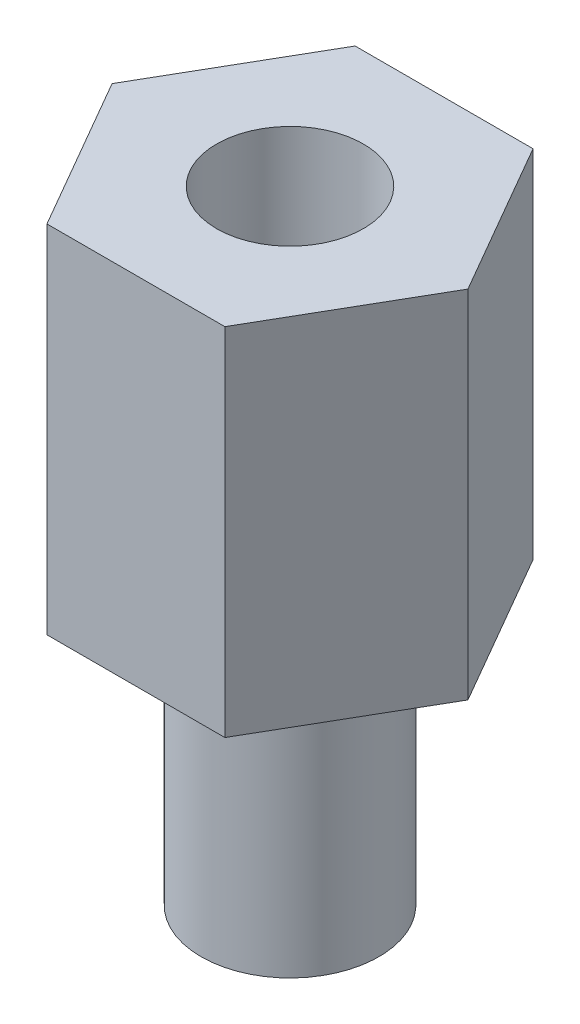
ISO-10303-21;
HEADER;
FILE_DESCRIPTION(('STEP AP214'),'2;1');
FILE_NAME('part.step','',(''),(''),'','','');
FILE_SCHEMA(('AUTOMOTIVE_DESIGN { 1 0 10303 214 1 1 1 1 }'));
ENDSEC;
DATA;
#1=APPLICATION_CONTEXT('core data for automotive mechanical design processes');
#2=APPLICATION_PROTOCOL_DEFINITION('international standard','automotive_design',2000,#1);
#3=PRODUCT_CONTEXT('',#1,'mechanical');
#4=PRODUCT('Part','Part','',(#3));
#5=PRODUCT_RELATED_PRODUCT_CATEGORY('part','',(#4));
#6=PRODUCT_DEFINITION_FORMATION('','',#4);
#7=PRODUCT_DEFINITION_CONTEXT('part definition',#1,'design');
#8=PRODUCT_DEFINITION('design','',#6,#7);
#9=PRODUCT_DEFINITION_SHAPE('','',#8);
#10=(LENGTH_UNIT() NAMED_UNIT(*) SI_UNIT(.MILLI.,.METRE.));
#11=(NAMED_UNIT(*) PLANE_ANGLE_UNIT() SI_UNIT($,.RADIAN.));
#12=(NAMED_UNIT(*) SI_UNIT($,.STERADIAN.) SOLID_ANGLE_UNIT());
#13=UNCERTAINTY_MEASURE_WITH_UNIT(LENGTH_MEASURE(1.E-05),#10,'distance_accuracy_value','');
#14=(GEOMETRIC_REPRESENTATION_CONTEXT(3) GLOBAL_UNCERTAINTY_ASSIGNED_CONTEXT((#13)) GLOBAL_UNIT_ASSIGNED_CONTEXT((#10,
#11,#12)) REPRESENTATION_CONTEXT('',''));
#15=CARTESIAN_POINT('',(0.,0.,0.));
#16=DIRECTION('',(0.,0.,1.));
#17=DIRECTION('',(1.,0.,0.));
#18=AXIS2_PLACEMENT_3D('',#15,#16,#17);
#19=CARTESIAN_POINT('',(0.,-6.,0.));
#20=DIRECTION('',(0.,1.,0.));
#21=DIRECTION('',(0.,0.,1.));
#22=AXIS2_PLACEMENT_3D('',#19,#20,#21);
#23=CYLINDRICAL_SURFACE('',#22,2.);
#24=CARTESIAN_POINT('',(0.,-6.,0.));
#25=DIRECTION('',(0.,1.,0.));
#26=DIRECTION('',(0.,0.,1.));
#27=AXIS2_PLACEMENT_3D('',#24,#25,#26);
#28=CIRCLE('',#27,2.);
#29=CARTESIAN_POINT('',(0.,-6.,2.));
#30=VERTEX_POINT('',#29);
#31=EDGE_CURVE('E11',#30,#30,#28,.T.);
#32=ORIENTED_EDGE('',*,*,#31,.T.);
#33=EDGE_LOOP('',(#32));
#34=FACE_BOUND('',#33,.T.);
#35=CARTESIAN_POINT('',(0.,0.,0.));
#36=DIRECTION('',(0.,1.,0.));
#37=DIRECTION('',(0.,0.,1.));
#38=AXIS2_PLACEMENT_3D('',#35,#36,#37);
#39=CIRCLE('',#38,2.);
#40=CARTESIAN_POINT('',(0.,0.,2.));
#41=VERTEX_POINT('',#40);
#42=EDGE_CURVE('E35',#41,#41,#39,.T.);
#43=ORIENTED_EDGE('',*,*,#42,.F.);
#44=EDGE_LOOP('',(#43));
#45=FACE_BOUND('',#44,.T.);
#46=ADVANCED_FACE('F32',(#34,#45),#23,.T.);
#47=CARTESIAN_POINT('',(0.,-6.,0.));
#48=DIRECTION('',(0.,1.,0.));
#49=DIRECTION('',(0.,0.,1.));
#50=AXIS2_PLACEMENT_3D('',#47,#48,#49);
#51=PLANE('',#50);
#52=ORIENTED_EDGE('',*,*,#31,.F.);
#53=EDGE_LOOP('',(#52));
#54=FACE_BOUND('',#53,.T.);
#55=ADVANCED_FACE('F146',(#54),#51,.F.);
#56=CARTESIAN_POINT('',(2.,8.,3.46410161513775));
#57=DIRECTION('',(-0.866025403784439,0.,-0.5));
#58=DIRECTION('',(-0.5,0.,0.866025403784439));
#59=AXIS2_PLACEMENT_3D('',#56,#57,#58);
#60=PLANE('',#59);
#61=DIRECTION('',(0.5,0.,-0.866025403784439));
#62=VECTOR('',#61,1.);
#63=CARTESIAN_POINT('',(2.,0.,3.46410161513775));
#64=LINE('',#63,#62);
#65=CARTESIAN_POINT('',(2.,0.,3.46410161513775));
#66=VERTEX_POINT('',#65);
#67=CARTESIAN_POINT('',(4.,0.,0.));
#68=VERTEX_POINT('',#67);
#69=EDGE_CURVE('E119',#66,#68,#64,.T.);
#70=ORIENTED_EDGE('',*,*,#69,.T.);
#71=DIRECTION('',(0.,-1.,0.));
#72=VECTOR('',#71,1.);
#73=CARTESIAN_POINT('',(4.,8.,0.));
#74=LINE('',#73,#72);
#75=CARTESIAN_POINT('',(4.,8.,0.));
#76=VERTEX_POINT('',#75);
#77=EDGE_CURVE('E137',#76,#68,#74,.T.);
#78=ORIENTED_EDGE('',*,*,#77,.F.);
#79=DIRECTION('',(0.5,0.,-0.866025403784439));
#80=VECTOR('',#79,1.);
#81=CARTESIAN_POINT('',(2.,8.,3.46410161513775));
#82=LINE('',#81,#80);
#83=CARTESIAN_POINT('',(2.,8.,3.46410161513775));
#84=VERTEX_POINT('',#83);
#85=EDGE_CURVE('E130',#84,#76,#82,.T.);
#86=ORIENTED_EDGE('',*,*,#85,.F.);
#87=DIRECTION('',(0.,-1.,0.));
#88=VECTOR('',#87,1.);
#89=CARTESIAN_POINT('',(2.,8.,3.46410161513775));
#90=LINE('',#89,#88);
#91=EDGE_CURVE('E115',#84,#66,#90,.T.);
#92=ORIENTED_EDGE('',*,*,#91,.T.);
#93=EDGE_LOOP('',(#70,#78,#86,#92));
#94=FACE_BOUND('',#93,.T.);
#95=ADVANCED_FACE('F151',(#94),#60,.F.);
#96=CARTESIAN_POINT('',(4.,8.,0.));
#97=DIRECTION('',(-0.866025403784439,0.,0.5));
#98=DIRECTION('',(0.5,0.,0.866025403784438));
#99=AXIS2_PLACEMENT_3D('',#96,#97,#98);
#100=PLANE('',#99);
#101=DIRECTION('',(-0.5,0.,-0.866025403784438));
#102=VECTOR('',#101,1.);
#103=CARTESIAN_POINT('',(4.,0.,0.));
#104=LINE('',#103,#102);
#105=CARTESIAN_POINT('',(2.,0.,-3.46410161513776));
#106=VERTEX_POINT('',#105);
#107=EDGE_CURVE('E122',#68,#106,#104,.T.);
#108=ORIENTED_EDGE('',*,*,#107,.T.);
#109=DIRECTION('',(0.,-1.,0.));
#110=VECTOR('',#109,1.);
#111=CARTESIAN_POINT('',(2.,8.,-3.46410161513776));
#112=LINE('',#111,#110);
#113=CARTESIAN_POINT('',(2.,8.,-3.46410161513776));
#114=VERTEX_POINT('',#113);
#115=EDGE_CURVE('E134',#114,#106,#112,.T.);
#116=ORIENTED_EDGE('',*,*,#115,.F.);
#117=DIRECTION('',(-0.5,0.,-0.866025403784438));
#118=VECTOR('',#117,1.);
#119=CARTESIAN_POINT('',(4.,8.,0.));
#120=LINE('',#119,#118);
#121=EDGE_CURVE('E87',#76,#114,#120,.T.);
#122=ORIENTED_EDGE('',*,*,#121,.F.);
#123=ORIENTED_EDGE('',*,*,#77,.T.);
#124=EDGE_LOOP('',(#108,#116,#122,#123));
#125=FACE_BOUND('',#124,.T.);
#126=ADVANCED_FACE('F157',(#125),#100,.F.);
#127=CARTESIAN_POINT('',(2.,8.,-3.46410161513776));
#128=DIRECTION('',(0.,0.,1.));
#129=DIRECTION('',(1.,0.,0.));
#130=AXIS2_PLACEMENT_3D('',#127,#128,#129);
#131=PLANE('',#130);
#132=DIRECTION('',(-1.,0.,0.));
#133=VECTOR('',#132,1.);
#134=CARTESIAN_POINT('',(2.,0.,-3.46410161513776));
#135=LINE('',#134,#133);
#136=CARTESIAN_POINT('',(-2.,0.,-3.46410161513775));
#137=VERTEX_POINT('',#136);
#138=EDGE_CURVE('E125',#106,#137,#135,.T.);
#139=ORIENTED_EDGE('',*,*,#138,.T.);
#140=DIRECTION('',(0.,-1.,0.));
#141=VECTOR('',#140,1.);
#142=CARTESIAN_POINT('',(-2.,8.,-3.46410161513775));
#143=LINE('',#142,#141);
#144=CARTESIAN_POINT('',(-2.,8.,-3.46410161513775));
#145=VERTEX_POINT('',#144);
#146=EDGE_CURVE('E110',#145,#137,#143,.T.);
#147=ORIENTED_EDGE('',*,*,#146,.F.);
#148=DIRECTION('',(-1.,0.,0.));
#149=VECTOR('',#148,1.);
#150=CARTESIAN_POINT('',(2.,8.,-3.46410161513776));
#151=LINE('',#150,#149);
#152=EDGE_CURVE('E101',#114,#145,#151,.T.);
#153=ORIENTED_EDGE('',*,*,#152,.F.);
#154=ORIENTED_EDGE('',*,*,#115,.T.);
#155=EDGE_LOOP('',(#139,#147,#153,#154));
#156=FACE_BOUND('',#155,.T.);
#157=ADVANCED_FACE('F163',(#156),#131,.F.);
#158=CARTESIAN_POINT('',(-2.,8.,-3.46410161513775));
#159=DIRECTION('',(0.866025403784439,0.,0.5));
#160=DIRECTION('',(0.5,0.,-0.866025403784439));
#161=AXIS2_PLACEMENT_3D('',#158,#159,#160);
#162=PLANE('',#161);
#163=DIRECTION('',(-0.5,0.,0.866025403784439));
#164=VECTOR('',#163,1.);
#165=CARTESIAN_POINT('',(-2.,0.,-3.46410161513775));
#166=LINE('',#165,#164);
#167=CARTESIAN_POINT('',(-4.,0.,0.));
#168=VERTEX_POINT('',#167);
#169=EDGE_CURVE('E109',#137,#168,#166,.T.);
#170=ORIENTED_EDGE('',*,*,#169,.T.);
#171=DIRECTION('',(0.,-1.,0.));
#172=VECTOR('',#171,1.);
#173=CARTESIAN_POINT('',(-4.,8.,0.));
#174=LINE('',#173,#172);
#175=CARTESIAN_POINT('',(-4.,8.,0.));
#176=VERTEX_POINT('',#175);
#177=EDGE_CURVE('E106',#176,#168,#174,.T.);
#178=ORIENTED_EDGE('',*,*,#177,.F.);
#179=DIRECTION('',(-0.5,0.,0.866025403784439));
#180=VECTOR('',#179,1.);
#181=CARTESIAN_POINT('',(-2.,8.,-3.46410161513775));
#182=LINE('',#181,#180);
#183=EDGE_CURVE('E95',#145,#176,#182,.T.);
#184=ORIENTED_EDGE('',*,*,#183,.F.);
#185=ORIENTED_EDGE('',*,*,#146,.T.);
#186=EDGE_LOOP('',(#170,#178,#184,#185));
#187=FACE_BOUND('',#186,.T.);
#188=ADVANCED_FACE('F107',(#187),#162,.F.);
#189=CARTESIAN_POINT('',(-4.,8.,0.));
#190=DIRECTION('',(0.866025403784438,0.,-0.5));
#191=DIRECTION('',(-0.5,0.,-0.866025403784439));
#192=AXIS2_PLACEMENT_3D('',#189,#190,#191);
#193=PLANE('',#192);
#194=DIRECTION('',(0.5,0.,0.866025403784438));
#195=VECTOR('',#194,1.);
#196=CARTESIAN_POINT('',(-4.,0.,0.));
#197=LINE('',#196,#195);
#198=CARTESIAN_POINT('',(-2.,0.,3.46410161513775));
#199=VERTEX_POINT('',#198);
#200=EDGE_CURVE('E72',#168,#199,#197,.T.);
#201=ORIENTED_EDGE('',*,*,#200,.T.);
#202=DIRECTION('',(0.,-1.,0.));
#203=VECTOR('',#202,1.);
#204=CARTESIAN_POINT('',(-2.,8.,3.46410161513775));
#205=LINE('',#204,#203);
#206=CARTESIAN_POINT('',(-2.,8.,3.46410161513775));
#207=VERTEX_POINT('',#206);
#208=EDGE_CURVE('E111',#207,#199,#205,.T.);
#209=ORIENTED_EDGE('',*,*,#208,.F.);
#210=DIRECTION('',(0.5,0.,0.866025403784438));
#211=VECTOR('',#210,1.);
#212=CARTESIAN_POINT('',(-4.,8.,0.));
#213=LINE('',#212,#211);
#214=EDGE_CURVE('E99',#176,#207,#213,.T.);
#215=ORIENTED_EDGE('',*,*,#214,.F.);
#216=ORIENTED_EDGE('',*,*,#177,.T.);
#217=EDGE_LOOP('',(#201,#209,#215,#216));
#218=FACE_BOUND('',#217,.T.);
#219=ADVANCED_FACE('F113',(#218),#193,.F.);
#220=CARTESIAN_POINT('',(-2.,8.,3.46410161513775));
#221=DIRECTION('',(0.,0.,-1.));
#222=DIRECTION('',(-1.,0.,0.));
#223=AXIS2_PLACEMENT_3D('',#220,#221,#222);
#224=PLANE('',#223);
#225=DIRECTION('',(1.,0.,0.));
#226=VECTOR('',#225,1.);
#227=CARTESIAN_POINT('',(-2.,0.,3.46410161513775));
#228=LINE('',#227,#226);
#229=EDGE_CURVE('E78',#199,#66,#228,.T.);
#230=ORIENTED_EDGE('',*,*,#229,.T.);
#231=ORIENTED_EDGE('',*,*,#91,.F.);
#232=DIRECTION('',(1.,0.,0.));
#233=VECTOR('',#232,1.);
#234=CARTESIAN_POINT('',(-2.,8.,3.46410161513775));
#235=LINE('',#234,#233);
#236=EDGE_CURVE('E48',#207,#84,#235,.T.);
#237=ORIENTED_EDGE('',*,*,#236,.F.);
#238=ORIENTED_EDGE('',*,*,#208,.T.);
#239=EDGE_LOOP('',(#230,#231,#237,#238));
#240=FACE_BOUND('',#239,.T.);
#241=ADVANCED_FACE('F171',(#240),#224,.F.);
#242=CARTESIAN_POINT('',(0.,8.,0.));
#243=DIRECTION('',(0.,1.,0.));
#244=DIRECTION('',(0.,0.,1.));
#245=AXIS2_PLACEMENT_3D('',#242,#243,#244);
#246=PLANE('',#245);
#247=CARTESIAN_POINT('',(0.,8.,0.));
#248=DIRECTION('',(0.,1.,0.));
#249=DIRECTION('',(0.,0.,1.));
#250=AXIS2_PLACEMENT_3D('',#247,#248,#249);
#251=CIRCLE('',#250,1.64999999999999);
#252=CARTESIAN_POINT('',(0.,8.,1.64999999999999));
#253=VERTEX_POINT('',#252);
#254=EDGE_CURVE('E193',#253,#253,#251,.T.);
#255=ORIENTED_EDGE('',*,*,#254,.F.);
#256=EDGE_LOOP('',(#255));
#257=FACE_BOUND('',#256,.T.);
#258=ORIENTED_EDGE('',*,*,#85,.T.);
#259=ORIENTED_EDGE('',*,*,#121,.T.);
#260=ORIENTED_EDGE('',*,*,#152,.T.);
#261=ORIENTED_EDGE('',*,*,#183,.T.);
#262=ORIENTED_EDGE('',*,*,#214,.T.);
#263=ORIENTED_EDGE('',*,*,#236,.T.);
#264=EDGE_LOOP('',(#258,#259,#260,#261,#262,#263));
#265=FACE_BOUND('',#264,.T.);
#266=ADVANCED_FACE('F97',(#257,#265),#246,.T.);
#267=CARTESIAN_POINT('',(0.,0.,0.));
#268=DIRECTION('',(0.,1.,0.));
#269=DIRECTION('',(0.,0.,1.));
#270=AXIS2_PLACEMENT_3D('',#267,#268,#269);
#271=PLANE('',#270);
#272=ORIENTED_EDGE('',*,*,#42,.T.);
#273=EDGE_LOOP('',(#272));
#274=FACE_BOUND('',#273,.T.);
#275=ORIENTED_EDGE('',*,*,#69,.F.);
#276=ORIENTED_EDGE('',*,*,#229,.F.);
#277=ORIENTED_EDGE('',*,*,#200,.F.);
#278=ORIENTED_EDGE('',*,*,#169,.F.);
#279=ORIENTED_EDGE('',*,*,#138,.F.);
#280=ORIENTED_EDGE('',*,*,#107,.F.);
#281=EDGE_LOOP('',(#275,#276,#277,#278,#279,#280));
#282=FACE_BOUND('',#281,.T.);
#283=ADVANCED_FACE('F142',(#274,#282),#271,.F.);
#284=CARTESIAN_POINT('',(0.,1.,0.));
#285=DIRECTION('',(0.,1.,0.));
#286=DIRECTION('',(0.,0.,1.));
#287=AXIS2_PLACEMENT_3D('',#284,#285,#286);
#288=CONICAL_SURFACE('',#287,1.65,1.02974425867665);
#289=CARTESIAN_POINT('',(0.,0.00857997860452542,0.));
#290=VERTEX_POINT('',#289);
#291=VERTEX_LOOP('',#290);
#292=FACE_BOUND('',#291,.T.);
#293=CARTESIAN_POINT('',(0.,1.,0.));
#294=DIRECTION('',(0.,1.,0.));
#295=DIRECTION('',(0.,0.,1.));
#296=AXIS2_PLACEMENT_3D('',#293,#294,#295);
#297=CIRCLE('',#296,1.65);
#298=CARTESIAN_POINT('',(0.,1.,1.65));
#299=VERTEX_POINT('',#298);
#300=EDGE_CURVE('E123',#299,#299,#297,.T.);
#301=ORIENTED_EDGE('',*,*,#300,.T.);
#302=EDGE_LOOP('',(#301));
#303=FACE_BOUND('',#302,.T.);
#304=ADVANCED_FACE('F176',(#292,#303),#288,.F.);
#305=CARTESIAN_POINT('',(0.,8.,0.));
#306=DIRECTION('',(0.,1.,0.));
#307=DIRECTION('',(0.,0.,1.));
#308=AXIS2_PLACEMENT_3D('',#305,#306,#307);
#309=CYLINDRICAL_SURFACE('',#308,1.64999999999999);
#310=ORIENTED_EDGE('',*,*,#300,.F.);
#311=EDGE_LOOP('',(#310));
#312=FACE_BOUND('',#311,.T.);
#313=ORIENTED_EDGE('',*,*,#254,.T.);
#314=EDGE_LOOP('',(#313));
#315=FACE_BOUND('',#314,.T.);
#316=ADVANCED_FACE('F182',(#312,#315),#309,.F.);
#317=CLOSED_SHELL('',(#46,#55,#95,#126,#157,#188,#219,#241,#266,#283,#304,#316));
#318=MANIFOLD_SOLID_BREP('B2',#317);
#319=ADVANCED_BREP_SHAPE_REPRESENTATION('',(#18,#318),#14);
#320=SHAPE_DEFINITION_REPRESENTATION(#9,#319);
ENDSEC;
END-ISO-10303-21;
